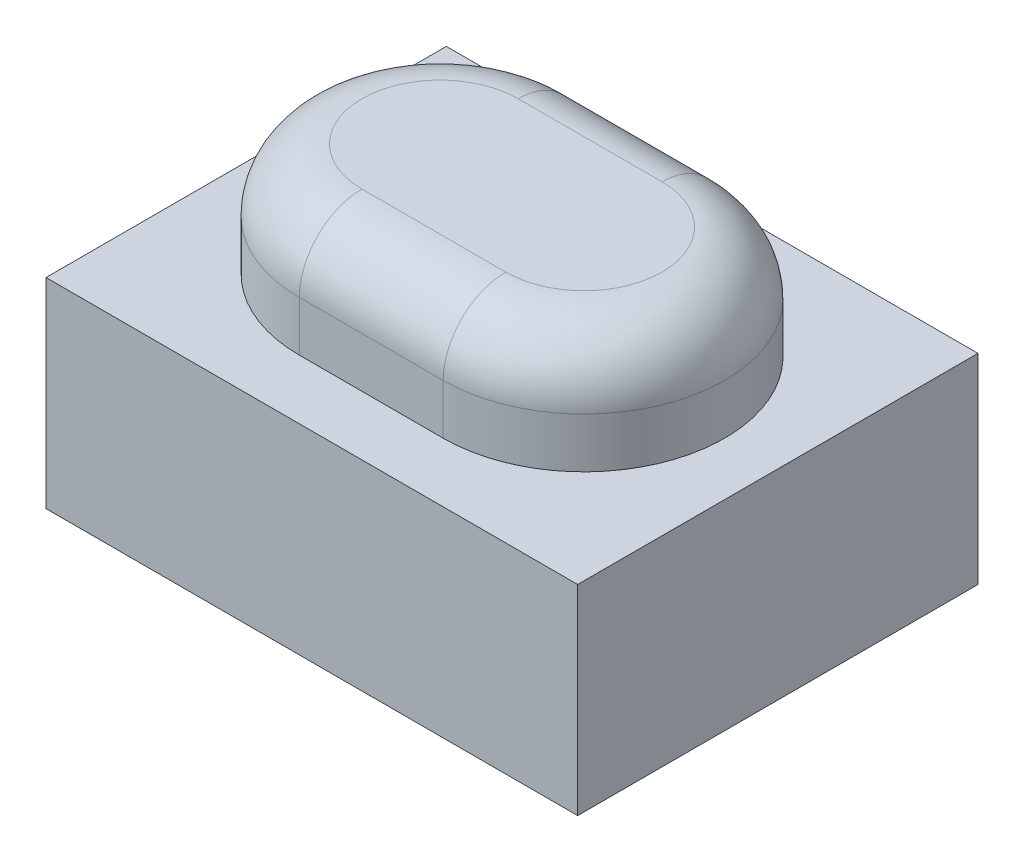
ISO-10303-21;
HEADER;
FILE_DESCRIPTION(('STEP AP214'),'2;1');
FILE_NAME('part.step','',(''),(''),'','','');
FILE_SCHEMA(('AUTOMOTIVE_DESIGN { 1 0 10303 214 1 1 1 1 }'));
ENDSEC;
DATA;
#1=APPLICATION_CONTEXT('core data for automotive mechanical design processes');
#2=APPLICATION_PROTOCOL_DEFINITION('international standard','automotive_design',2000,#1);
#3=PRODUCT_CONTEXT('',#1,'mechanical');
#4=PRODUCT('Part','Part','',(#3));
#5=PRODUCT_RELATED_PRODUCT_CATEGORY('part','',(#4));
#6=PRODUCT_DEFINITION_FORMATION('','',#4);
#7=PRODUCT_DEFINITION_CONTEXT('part definition',#1,'design');
#8=PRODUCT_DEFINITION('design','',#6,#7);
#9=PRODUCT_DEFINITION_SHAPE('','',#8);
#10=(LENGTH_UNIT() NAMED_UNIT(*) SI_UNIT(.MILLI.,.METRE.));
#11=(NAMED_UNIT(*) PLANE_ANGLE_UNIT() SI_UNIT($,.RADIAN.));
#12=(NAMED_UNIT(*) SI_UNIT($,.STERADIAN.) SOLID_ANGLE_UNIT());
#13=UNCERTAINTY_MEASURE_WITH_UNIT(LENGTH_MEASURE(1.E-05),#10,'distance_accuracy_value','');
#14=(GEOMETRIC_REPRESENTATION_CONTEXT(3) GLOBAL_UNCERTAINTY_ASSIGNED_CONTEXT((#13)) GLOBAL_UNIT_ASSIGNED_CONTEXT((#10,
#11,#12)) REPRESENTATION_CONTEXT('',''));
#15=CARTESIAN_POINT('',(0.,0.,0.));
#16=DIRECTION('',(0.,0.,1.));
#17=DIRECTION('',(1.,0.,0.));
#18=AXIS2_PLACEMENT_3D('',#15,#16,#17);
#19=CARTESIAN_POINT('',(-0.575,2.5,0.));
#20=DIRECTION('',(0.,1.,0.));
#21=DIRECTION('',(0.,0.,1.));
#22=AXIS2_PLACEMENT_3D('',#19,#20,#21);
#23=PLANE('',#22);
#24=CARTESIAN_POINT('',(-0.575,2.5,0.));
#25=DIRECTION('',(0.,-1.,0.));
#26=DIRECTION('',(0.,0.,1.));
#27=AXIS2_PLACEMENT_3D('',#24,#25,#26);
#28=CIRCLE('',#27,0.625);
#29=CARTESIAN_POINT('',(-0.575,2.5,0.625));
#30=VERTEX_POINT('',#29);
#31=CARTESIAN_POINT('',(-0.575,2.5,-0.625));
#32=VERTEX_POINT('',#31);
#33=EDGE_CURVE('E224',#30,#32,#28,.T.);
#34=ORIENTED_EDGE('',*,*,#33,.F.);
#35=DIRECTION('',(-1.,0.,0.));
#36=VECTOR('',#35,1.);
#37=CARTESIAN_POINT('',(-0.575,2.5,0.625));
#38=LINE('',#37,#36);
#39=CARTESIAN_POINT('',(0.575,2.5,0.625));
#40=VERTEX_POINT('',#39);
#41=EDGE_CURVE('E170',#40,#30,#38,.T.);
#42=ORIENTED_EDGE('',*,*,#41,.F.);
#43=CARTESIAN_POINT('',(0.575,2.5,0.));
#44=DIRECTION('',(0.,-1.,0.));
#45=DIRECTION('',(0.,0.,-1.));
#46=AXIS2_PLACEMENT_3D('',#43,#44,#45);
#47=CIRCLE('',#46,0.625);
#48=CARTESIAN_POINT('',(0.575,2.5,-0.625));
#49=VERTEX_POINT('',#48);
#50=EDGE_CURVE('E185',#49,#40,#47,.T.);
#51=ORIENTED_EDGE('',*,*,#50,.F.);
#52=DIRECTION('',(1.,0.,0.));
#53=VECTOR('',#52,1.);
#54=CARTESIAN_POINT('',(-0.575,2.5,-0.625));
#55=LINE('',#54,#53);
#56=EDGE_CURVE('E206',#32,#49,#55,.T.);
#57=ORIENTED_EDGE('',*,*,#56,.F.);
#58=EDGE_LOOP('',(#34,#42,#51,#57));
#59=FACE_BOUND('',#58,.T.);
#60=ADVANCED_FACE('F16',(#59),#23,.T.);
#61=CARTESIAN_POINT('',(-0.575,2.,0.625));
#62=DIRECTION('',(-1.,0.,0.));
#63=DIRECTION('',(0.,0.,1.));
#64=AXIS2_PLACEMENT_3D('',#61,#62,#63);
#65=CYLINDRICAL_SURFACE('',#64,0.5);
#66=CARTESIAN_POINT('',(0.575,2.,0.625));
#67=DIRECTION('',(1.,0.,0.));
#68=DIRECTION('',(0.,0.,1.));
#69=AXIS2_PLACEMENT_3D('',#66,#67,#68);
#70=CIRCLE('',#69,0.5);
#71=CARTESIAN_POINT('',(0.575,2.,1.125));
#72=VERTEX_POINT('',#71);
#73=EDGE_CURVE('E177',#40,#72,#70,.T.);
#74=ORIENTED_EDGE('',*,*,#73,.F.);
#75=ORIENTED_EDGE('',*,*,#41,.T.);
#76=CARTESIAN_POINT('',(-0.575,2.,0.625));
#77=DIRECTION('',(1.,0.,0.));
#78=DIRECTION('',(0.,0.,1.));
#79=AXIS2_PLACEMENT_3D('',#76,#77,#78);
#80=CIRCLE('',#79,0.5);
#81=CARTESIAN_POINT('',(-0.575,2.,1.125));
#82=VERTEX_POINT('',#81);
#83=EDGE_CURVE('E209',#82,#30,#80,.F.);
#84=ORIENTED_EDGE('',*,*,#83,.F.);
#85=DIRECTION('',(-1.,0.,0.));
#86=VECTOR('',#85,1.);
#87=CARTESIAN_POINT('',(-0.575,2.,1.125));
#88=LINE('',#87,#86);
#89=EDGE_CURVE('E244',#82,#72,#88,.F.);
#90=ORIENTED_EDGE('',*,*,#89,.T.);
#91=EDGE_LOOP('',(#74,#75,#84,#90));
#92=FACE_BOUND('',#91,.T.);
#93=ADVANCED_FACE('F197',(#92),#65,.T.);
#94=CARTESIAN_POINT('',(0.575,2.,0.));
#95=DIRECTION('',(0.,1.,0.));
#96=DIRECTION('',(0.,0.,1.));
#97=AXIS2_PLACEMENT_3D('',#94,#95,#96);
#98=TOROIDAL_SURFACE('',#97,0.625,0.5);
#99=CARTESIAN_POINT('',(0.575,2.,-0.625));
#100=DIRECTION('',(1.,0.,0.));
#101=DIRECTION('',(0.,0.,-1.));
#102=AXIS2_PLACEMENT_3D('',#99,#100,#101);
#103=CIRCLE('',#102,0.5);
#104=CARTESIAN_POINT('',(0.575,2.,-1.125));
#105=VERTEX_POINT('',#104);
#106=EDGE_CURVE('E210',#49,#105,#103,.F.);
#107=ORIENTED_EDGE('',*,*,#106,.F.);
#108=ORIENTED_EDGE('',*,*,#50,.T.);
#109=ORIENTED_EDGE('',*,*,#73,.T.);
#110=CARTESIAN_POINT('',(0.575,2.,0.));
#111=DIRECTION('',(0.,-1.,0.));
#112=DIRECTION('',(0.,0.,-1.));
#113=AXIS2_PLACEMENT_3D('',#110,#111,#112);
#114=CIRCLE('',#113,1.125);
#115=EDGE_CURVE('E138',#105,#72,#114,.T.);
#116=ORIENTED_EDGE('',*,*,#115,.F.);
#117=EDGE_LOOP('',(#107,#108,#109,#116));
#118=FACE_BOUND('',#117,.T.);
#119=ADVANCED_FACE('F188',(#118),#98,.T.);
#120=CARTESIAN_POINT('',(-0.575,2.,-0.625));
#121=DIRECTION('',(1.,0.,0.));
#122=DIRECTION('',(0.,0.,-1.));
#123=AXIS2_PLACEMENT_3D('',#120,#121,#122);
#124=CYLINDRICAL_SURFACE('',#123,0.5);
#125=CARTESIAN_POINT('',(-0.575,2.,-0.625));
#126=DIRECTION('',(-1.,0.,0.));
#127=DIRECTION('',(0.,0.,-1.));
#128=AXIS2_PLACEMENT_3D('',#125,#126,#127);
#129=CIRCLE('',#128,0.5);
#130=CARTESIAN_POINT('',(-0.575,2.,-1.125));
#131=VERTEX_POINT('',#130);
#132=EDGE_CURVE('E150',#32,#131,#129,.T.);
#133=ORIENTED_EDGE('',*,*,#132,.F.);
#134=ORIENTED_EDGE('',*,*,#56,.T.);
#135=ORIENTED_EDGE('',*,*,#106,.T.);
#136=DIRECTION('',(1.,0.,0.));
#137=VECTOR('',#136,1.);
#138=CARTESIAN_POINT('',(-0.575,2.,-1.125));
#139=LINE('',#138,#137);
#140=EDGE_CURVE('E112',#105,#131,#139,.F.);
#141=ORIENTED_EDGE('',*,*,#140,.T.);
#142=EDGE_LOOP('',(#133,#134,#135,#141));
#143=FACE_BOUND('',#142,.T.);
#144=ADVANCED_FACE('F159',(#143),#124,.T.);
#145=CARTESIAN_POINT('',(-0.575,2.,0.));
#146=DIRECTION('',(0.,1.,0.));
#147=DIRECTION('',(0.,0.,1.));
#148=AXIS2_PLACEMENT_3D('',#145,#146,#147);
#149=TOROIDAL_SURFACE('',#148,0.625,0.5);
#150=ORIENTED_EDGE('',*,*,#132,.T.);
#151=CARTESIAN_POINT('',(-0.575,2.,0.));
#152=DIRECTION('',(0.,-1.,0.));
#153=DIRECTION('',(0.,0.,-1.));
#154=AXIS2_PLACEMENT_3D('',#151,#152,#153);
#155=CIRCLE('',#154,1.125);
#156=EDGE_CURVE('E127',#82,#131,#155,.T.);
#157=ORIENTED_EDGE('',*,*,#156,.F.);
#158=ORIENTED_EDGE('',*,*,#83,.T.);
#159=ORIENTED_EDGE('',*,*,#33,.T.);
#160=EDGE_LOOP('',(#150,#157,#158,#159));
#161=FACE_BOUND('',#160,.T.);
#162=ADVANCED_FACE('F153',(#161),#149,.T.);
#163=CARTESIAN_POINT('',(-0.575,2.5,1.125));
#164=DIRECTION('',(0.,0.,-1.));
#165=DIRECTION('',(-1.,0.,0.));
#166=AXIS2_PLACEMENT_3D('',#163,#164,#165);
#167=PLANE('',#166);
#168=ORIENTED_EDGE('',*,*,#89,.F.);
#169=DIRECTION('',(0.,-1.,0.));
#170=VECTOR('',#169,1.);
#171=CARTESIAN_POINT('',(-0.575,2.5,1.125));
#172=LINE('',#171,#170);
#173=CARTESIAN_POINT('',(-0.575,1.6,1.125));
#174=VERTEX_POINT('',#173);
#175=EDGE_CURVE('E130',#174,#82,#172,.F.);
#176=ORIENTED_EDGE('',*,*,#175,.F.);
#177=DIRECTION('',(1.,0.,0.));
#178=VECTOR('',#177,1.);
#179=CARTESIAN_POINT('',(0.,1.6,1.125));
#180=LINE('',#179,#178);
#181=CARTESIAN_POINT('',(0.575,1.6,1.125));
#182=VERTEX_POINT('',#181);
#183=EDGE_CURVE('E92',#174,#182,#180,.T.);
#184=ORIENTED_EDGE('',*,*,#183,.T.);
#185=DIRECTION('',(0.,-1.,0.));
#186=VECTOR('',#185,1.);
#187=CARTESIAN_POINT('',(0.575,2.5,1.125));
#188=LINE('',#187,#186);
#189=EDGE_CURVE('E103',#72,#182,#188,.T.);
#190=ORIENTED_EDGE('',*,*,#189,.F.);
#191=EDGE_LOOP('',(#168,#176,#184,#190));
#192=FACE_BOUND('',#191,.T.);
#193=ADVANCED_FACE('F158',(#192),#167,.F.);
#194=CARTESIAN_POINT('',(0.575,2.5,0.));
#195=DIRECTION('',(0.,-1.,0.));
#196=DIRECTION('',(0.,0.,-1.));
#197=AXIS2_PLACEMENT_3D('',#194,#195,#196);
#198=CYLINDRICAL_SURFACE('',#197,1.125);
#199=ORIENTED_EDGE('',*,*,#189,.T.);
#200=CARTESIAN_POINT('',(0.575,1.6,0.));
#201=DIRECTION('',(0.,-1.,0.));
#202=DIRECTION('',(0.,0.,-1.));
#203=AXIS2_PLACEMENT_3D('',#200,#201,#202);
#204=CIRCLE('',#203,1.125);
#205=CARTESIAN_POINT('',(0.575,1.6,-1.125));
#206=VERTEX_POINT('',#205);
#207=EDGE_CURVE('E20',#182,#206,#204,.F.);
#208=ORIENTED_EDGE('',*,*,#207,.T.);
#209=DIRECTION('',(0.,1.,0.));
#210=VECTOR('',#209,1.);
#211=CARTESIAN_POINT('',(0.575,2.5,-1.125));
#212=LINE('',#211,#210);
#213=EDGE_CURVE('E101',#206,#105,#212,.T.);
#214=ORIENTED_EDGE('',*,*,#213,.T.);
#215=ORIENTED_EDGE('',*,*,#115,.T.);
#216=EDGE_LOOP('',(#199,#208,#214,#215));
#217=FACE_BOUND('',#216,.T.);
#218=ADVANCED_FACE('F99',(#217),#198,.T.);
#219=CARTESIAN_POINT('',(-0.575,2.5,-1.125));
#220=DIRECTION('',(0.,0.,1.));
#221=DIRECTION('',(1.,0.,0.));
#222=AXIS2_PLACEMENT_3D('',#219,#220,#221);
#223=PLANE('',#222);
#224=ORIENTED_EDGE('',*,*,#140,.F.);
#225=ORIENTED_EDGE('',*,*,#213,.F.);
#226=DIRECTION('',(1.,0.,0.));
#227=VECTOR('',#226,1.);
#228=CARTESIAN_POINT('',(0.,1.6,-1.125));
#229=LINE('',#228,#227);
#230=CARTESIAN_POINT('',(-0.575,1.6,-1.125));
#231=VERTEX_POINT('',#230);
#232=EDGE_CURVE('E106',#206,#231,#229,.F.);
#233=ORIENTED_EDGE('',*,*,#232,.T.);
#234=DIRECTION('',(0.,-1.,0.));
#235=VECTOR('',#234,1.);
#236=CARTESIAN_POINT('',(-0.575,2.5,-1.125));
#237=LINE('',#236,#235);
#238=EDGE_CURVE('E125',#131,#231,#237,.T.);
#239=ORIENTED_EDGE('',*,*,#238,.F.);
#240=EDGE_LOOP('',(#224,#225,#233,#239));
#241=FACE_BOUND('',#240,.T.);
#242=ADVANCED_FACE('F109',(#241),#223,.F.);
#243=CARTESIAN_POINT('',(-0.575,2.5,0.));
#244=DIRECTION('',(0.,-1.,0.));
#245=DIRECTION('',(0.,0.,-1.));
#246=AXIS2_PLACEMENT_3D('',#243,#244,#245);
#247=CYLINDRICAL_SURFACE('',#246,1.125);
#248=ORIENTED_EDGE('',*,*,#238,.T.);
#249=CARTESIAN_POINT('',(-0.575,1.6,0.));
#250=DIRECTION('',(0.,-1.,0.));
#251=DIRECTION('',(0.,0.,-1.));
#252=AXIS2_PLACEMENT_3D('',#249,#250,#251);
#253=CIRCLE('',#252,1.125);
#254=EDGE_CURVE('E118',#231,#174,#253,.F.);
#255=ORIENTED_EDGE('',*,*,#254,.T.);
#256=ORIENTED_EDGE('',*,*,#175,.T.);
#257=ORIENTED_EDGE('',*,*,#156,.T.);
#258=EDGE_LOOP('',(#248,#255,#256,#257));
#259=FACE_BOUND('',#258,.T.);
#260=ADVANCED_FACE('F280',(#259),#247,.T.);
#261=CARTESIAN_POINT('',(0.,1.6,0.));
#262=DIRECTION('',(0.,-1.,0.));
#263=DIRECTION('',(0.,0.,-1.));
#264=AXIS2_PLACEMENT_3D('',#261,#262,#263);
#265=PLANE('',#264);
#266=ORIENTED_EDGE('',*,*,#232,.F.);
#267=ORIENTED_EDGE('',*,*,#207,.F.);
#268=ORIENTED_EDGE('',*,*,#183,.F.);
#269=ORIENTED_EDGE('',*,*,#254,.F.);
#270=EDGE_LOOP('',(#266,#267,#268,#269));
#271=FACE_BOUND('',#270,.T.);
#272=DIRECTION('',(1.,0.,0.));
#273=VECTOR('',#272,1.);
#274=CARTESIAN_POINT('',(-2.125,1.6,-1.6));
#275=LINE('',#274,#273);
#276=CARTESIAN_POINT('',(2.125,1.6,-1.6));
#277=VERTEX_POINT('',#276);
#278=CARTESIAN_POINT('',(-2.125,1.6,-1.6));
#279=VERTEX_POINT('',#278);
#280=EDGE_CURVE('E408',#277,#279,#275,.F.);
#281=ORIENTED_EDGE('',*,*,#280,.T.);
#282=DIRECTION('',(0.,0.,-1.));
#283=VECTOR('',#282,1.);
#284=CARTESIAN_POINT('',(-2.125,1.6,1.6));
#285=LINE('',#284,#283);
#286=CARTESIAN_POINT('',(-2.125,1.6,1.6));
#287=VERTEX_POINT('',#286);
#288=EDGE_CURVE('E416',#279,#287,#285,.F.);
#289=ORIENTED_EDGE('',*,*,#288,.T.);
#290=DIRECTION('',(-1.,0.,0.));
#291=VECTOR('',#290,1.);
#292=CARTESIAN_POINT('',(-2.125,1.6,1.6));
#293=LINE('',#292,#291);
#294=CARTESIAN_POINT('',(2.125,1.6,1.6));
#295=VERTEX_POINT('',#294);
#296=EDGE_CURVE('E419',#287,#295,#293,.F.);
#297=ORIENTED_EDGE('',*,*,#296,.T.);
#298=DIRECTION('',(0.,0.,1.));
#299=VECTOR('',#298,1.);
#300=CARTESIAN_POINT('',(2.125,1.6,1.6));
#301=LINE('',#300,#299);
#302=EDGE_CURVE('E120',#295,#277,#301,.F.);
#303=ORIENTED_EDGE('',*,*,#302,.T.);
#304=EDGE_LOOP('',(#281,#289,#297,#303));
#305=FACE_BOUND('',#304,.T.);
#306=ADVANCED_FACE('F115',(#271,#305),#265,.F.);
#307=CARTESIAN_POINT('',(2.125,1.6,1.6));
#308=DIRECTION('',(-1.,0.,0.));
#309=DIRECTION('',(0.,0.,1.));
#310=AXIS2_PLACEMENT_3D('',#307,#308,#309);
#311=PLANE('',#310);
#312=DIRECTION('',(0.,1.,0.));
#313=VECTOR('',#312,1.);
#314=CARTESIAN_POINT('',(2.125,1.6,-1.6));
#315=LINE('',#314,#313);
#316=CARTESIAN_POINT('',(2.125,0.,-1.6));
#317=VERTEX_POINT('',#316);
#318=EDGE_CURVE('E403',#317,#277,#315,.T.);
#319=ORIENTED_EDGE('',*,*,#318,.T.);
#320=ORIENTED_EDGE('',*,*,#302,.F.);
#321=DIRECTION('',(0.,1.,0.));
#322=VECTOR('',#321,1.);
#323=CARTESIAN_POINT('',(2.125,1.6,1.6));
#324=LINE('',#323,#322);
#325=CARTESIAN_POINT('',(2.125,0.,1.6));
#326=VERTEX_POINT('',#325);
#327=EDGE_CURVE('E418',#295,#326,#324,.F.);
#328=ORIENTED_EDGE('',*,*,#327,.T.);
#329=DIRECTION('',(0.,0.,-1.));
#330=VECTOR('',#329,1.);
#331=CARTESIAN_POINT('',(2.125,0.,0.));
#332=LINE('',#331,#330);
#333=EDGE_CURVE('E407',#317,#326,#332,.F.);
#334=ORIENTED_EDGE('',*,*,#333,.F.);
#335=EDGE_LOOP('',(#319,#320,#328,#334));
#336=FACE_BOUND('',#335,.T.);
#337=ADVANCED_FACE('F273',(#336),#311,.F.);
#338=CARTESIAN_POINT('',(-2.125,1.6,1.6));
#339=DIRECTION('',(0.,0.,-1.));
#340=DIRECTION('',(-1.,0.,0.));
#341=AXIS2_PLACEMENT_3D('',#338,#339,#340);
#342=PLANE('',#341);
#343=ORIENTED_EDGE('',*,*,#327,.F.);
#344=ORIENTED_EDGE('',*,*,#296,.F.);
#345=DIRECTION('',(0.,1.,0.));
#346=VECTOR('',#345,1.);
#347=CARTESIAN_POINT('',(-2.125,1.6,1.6));
#348=LINE('',#347,#346);
#349=CARTESIAN_POINT('',(-2.125,0.,1.6));
#350=VERTEX_POINT('',#349);
#351=EDGE_CURVE('E409',#287,#350,#348,.F.);
#352=ORIENTED_EDGE('',*,*,#351,.T.);
#353=DIRECTION('',(1.,0.,0.));
#354=VECTOR('',#353,1.);
#355=CARTESIAN_POINT('',(0.,0.,1.6));
#356=LINE('',#355,#354);
#357=EDGE_CURVE('E424',#326,#350,#356,.F.);
#358=ORIENTED_EDGE('',*,*,#357,.F.);
#359=EDGE_LOOP('',(#343,#344,#352,#358));
#360=FACE_BOUND('',#359,.T.);
#361=ADVANCED_FACE('F270',(#360),#342,.F.);
#362=CARTESIAN_POINT('',(-2.125,1.6,1.6));
#363=DIRECTION('',(1.,0.,0.));
#364=DIRECTION('',(0.,0.,-1.));
#365=AXIS2_PLACEMENT_3D('',#362,#363,#364);
#366=PLANE('',#365);
#367=ORIENTED_EDGE('',*,*,#351,.F.);
#368=ORIENTED_EDGE('',*,*,#288,.F.);
#369=DIRECTION('',(0.,1.,0.));
#370=VECTOR('',#369,1.);
#371=CARTESIAN_POINT('',(-2.125,1.6,-1.6));
#372=LINE('',#371,#370);
#373=CARTESIAN_POINT('',(-2.125,0.,-1.6));
#374=VERTEX_POINT('',#373);
#375=EDGE_CURVE('E35',#279,#374,#372,.F.);
#376=ORIENTED_EDGE('',*,*,#375,.T.);
#377=DIRECTION('',(0.,0.,-1.));
#378=VECTOR('',#377,1.);
#379=CARTESIAN_POINT('',(-2.125,0.,0.));
#380=LINE('',#379,#378);
#381=EDGE_CURVE('E26',#350,#374,#380,.T.);
#382=ORIENTED_EDGE('',*,*,#381,.F.);
#383=EDGE_LOOP('',(#367,#368,#376,#382));
#384=FACE_BOUND('',#383,.T.);
#385=ADVANCED_FACE('F263',(#384),#366,.F.);
#386=CARTESIAN_POINT('',(-2.125,1.6,-1.6));
#387=DIRECTION('',(0.,0.,1.));
#388=DIRECTION('',(1.,0.,0.));
#389=AXIS2_PLACEMENT_3D('',#386,#387,#388);
#390=PLANE('',#389);
#391=ORIENTED_EDGE('',*,*,#375,.F.);
#392=ORIENTED_EDGE('',*,*,#280,.F.);
#393=ORIENTED_EDGE('',*,*,#318,.F.);
#394=DIRECTION('',(1.,0.,0.));
#395=VECTOR('',#394,1.);
#396=CARTESIAN_POINT('',(0.,0.,-1.6));
#397=LINE('',#396,#395);
#398=EDGE_CURVE('E10',#374,#317,#397,.T.);
#399=ORIENTED_EDGE('',*,*,#398,.F.);
#400=EDGE_LOOP('',(#391,#392,#393,#399));
#401=FACE_BOUND('',#400,.T.);
#402=ADVANCED_FACE('F257',(#401),#390,.F.);
#403=CARTESIAN_POINT('',(0.,0.,0.));
#404=DIRECTION('',(0.,-1.,0.));
#405=DIRECTION('',(0.,0.,-1.));
#406=AXIS2_PLACEMENT_3D('',#403,#404,#405);
#407=PLANE('',#406);
#408=ORIENTED_EDGE('',*,*,#381,.T.);
#409=ORIENTED_EDGE('',*,*,#398,.T.);
#410=ORIENTED_EDGE('',*,*,#333,.T.);
#411=ORIENTED_EDGE('',*,*,#357,.T.);
#412=EDGE_LOOP('',(#408,#409,#410,#411));
#413=FACE_BOUND('',#412,.T.);
#414=ADVANCED_FACE('F255',(#413),#407,.T.);
#415=CLOSED_SHELL('',(#60,#93,#119,#144,#162,#193,#218,#242,#260,#306,#337,#361,#385,#402,#414));
#416=MANIFOLD_SOLID_BREP('B1',#415);
#417=ADVANCED_BREP_SHAPE_REPRESENTATION('',(#18,#416),#14);
#418=SHAPE_DEFINITION_REPRESENTATION(#9,#417);
ENDSEC;
END-ISO-10303-21;
